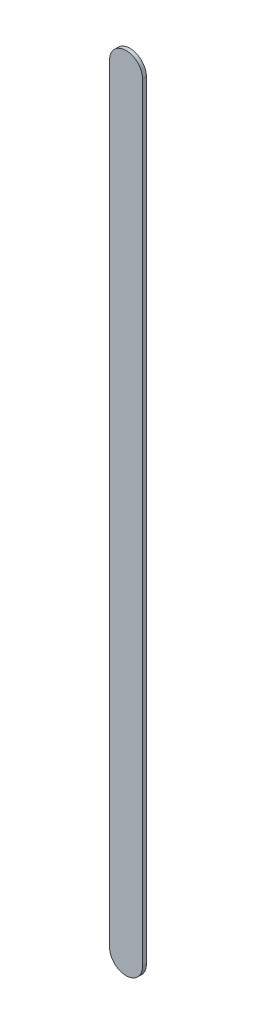
ISO-10303-21;
HEADER;
FILE_DESCRIPTION(('STEP AP214'),'2;1');
FILE_NAME('part.step','',(''),(''),'','','');
FILE_SCHEMA(('AUTOMOTIVE_DESIGN { 1 0 10303 214 1 1 1 1 }'));
ENDSEC;
DATA;
#1=APPLICATION_CONTEXT('core data for automotive mechanical design processes');
#2=APPLICATION_PROTOCOL_DEFINITION('international standard','automotive_design',2000,#1);
#3=PRODUCT_CONTEXT('',#1,'mechanical');
#4=PRODUCT('Part','Part','',(#3));
#5=PRODUCT_RELATED_PRODUCT_CATEGORY('part','',(#4));
#6=PRODUCT_DEFINITION_FORMATION('','',#4);
#7=PRODUCT_DEFINITION_CONTEXT('part definition',#1,'design');
#8=PRODUCT_DEFINITION('design','',#6,#7);
#9=PRODUCT_DEFINITION_SHAPE('','',#8);
#10=(LENGTH_UNIT() NAMED_UNIT(*) SI_UNIT(.MILLI.,.METRE.));
#11=(NAMED_UNIT(*) PLANE_ANGLE_UNIT() SI_UNIT($,.RADIAN.));
#12=(NAMED_UNIT(*) SI_UNIT($,.STERADIAN.) SOLID_ANGLE_UNIT());
#13=UNCERTAINTY_MEASURE_WITH_UNIT(LENGTH_MEASURE(1.E-05),#10,'distance_accuracy_value','');
#14=(GEOMETRIC_REPRESENTATION_CONTEXT(3) GLOBAL_UNCERTAINTY_ASSIGNED_CONTEXT((#13)) GLOBAL_UNIT_ASSIGNED_CONTEXT((#10,
#11,#12)) REPRESENTATION_CONTEXT('',''));
#15=CARTESIAN_POINT('',(0.,0.,0.));
#16=DIRECTION('',(0.,0.,1.));
#17=DIRECTION('',(1.,0.,0.));
#18=AXIS2_PLACEMENT_3D('',#15,#16,#17);
#19=CARTESIAN_POINT('',(127.07,-59.41,1.635));
#20=DIRECTION('',(0.,0.,1.));
#21=DIRECTION('',(1.,0.,0.));
#22=AXIS2_PLACEMENT_3D('',#19,#20,#21);
#23=PLANE('',#22);
#24=DIRECTION('',(0.,1.,0.));
#25=VECTOR('',#24,1.);
#26=CARTESIAN_POINT('',(127.07,-59.41,1.635));
#27=LINE('',#26,#25);
#28=CARTESIAN_POINT('',(127.07,-59.41,1.635));
#29=VERTEX_POINT('',#28);
#30=CARTESIAN_POINT('',(127.07,-52.42,1.635));
#31=VERTEX_POINT('',#30);
#32=EDGE_CURVE('E74',#29,#31,#27,.T.);
#33=ORIENTED_EDGE('',*,*,#32,.T.);
#34=CARTESIAN_POINT('',(126.92,-52.42,1.635));
#35=DIRECTION('',(0.,0.,1.));
#36=DIRECTION('',(1.,0.,0.));
#37=AXIS2_PLACEMENT_3D('',#34,#35,#36);
#38=CIRCLE('',#37,0.15);
#39=CARTESIAN_POINT('',(126.77,-52.42,1.635));
#40=VERTEX_POINT('',#39);
#41=EDGE_CURVE('E72',#31,#40,#38,.T.);
#42=ORIENTED_EDGE('',*,*,#41,.T.);
#43=DIRECTION('',(0.,-1.,0.));
#44=VECTOR('',#43,1.);
#45=CARTESIAN_POINT('',(126.77,-52.42,1.635));
#46=LINE('',#45,#44);
#47=CARTESIAN_POINT('',(126.77,-59.41,1.635));
#48=VERTEX_POINT('',#47);
#49=EDGE_CURVE('E60',#40,#48,#46,.T.);
#50=ORIENTED_EDGE('',*,*,#49,.T.);
#51=CARTESIAN_POINT('',(126.92,-59.41,1.635));
#52=DIRECTION('',(0.,0.,1.));
#53=DIRECTION('',(-1.,0.,0.));
#54=AXIS2_PLACEMENT_3D('',#51,#52,#53);
#55=CIRCLE('',#54,0.15);
#56=EDGE_CURVE('E11',#48,#29,#55,.T.);
#57=ORIENTED_EDGE('',*,*,#56,.T.);
#58=EDGE_LOOP('',(#33,#42,#50,#57));
#59=FACE_BOUND('',#58,.T.);
#60=ADVANCED_FACE('F17',(#59),#23,.T.);
#61=CARTESIAN_POINT('',(127.07,-59.41,1.6));
#62=DIRECTION('',(0.,0.,1.));
#63=DIRECTION('',(1.,0.,0.));
#64=AXIS2_PLACEMENT_3D('',#61,#62,#63);
#65=PLANE('',#64);
#66=CARTESIAN_POINT('',(126.92,-59.41,1.6));
#67=DIRECTION('',(0.,0.,1.));
#68=DIRECTION('',(-1.,0.,0.));
#69=AXIS2_PLACEMENT_3D('',#66,#67,#68);
#70=CIRCLE('',#69,0.15);
#71=CARTESIAN_POINT('',(126.77,-59.41,1.6));
#72=VERTEX_POINT('',#71);
#73=CARTESIAN_POINT('',(127.07,-59.41,1.6));
#74=VERTEX_POINT('',#73);
#75=EDGE_CURVE('E20',#72,#74,#70,.T.);
#76=ORIENTED_EDGE('',*,*,#75,.F.);
#77=DIRECTION('',(0.,-1.,0.));
#78=VECTOR('',#77,1.);
#79=CARTESIAN_POINT('',(126.77,-52.42,1.6));
#80=LINE('',#79,#78);
#81=CARTESIAN_POINT('',(126.77,-52.42,1.6));
#82=VERTEX_POINT('',#81);
#83=EDGE_CURVE('E79',#82,#72,#80,.T.);
#84=ORIENTED_EDGE('',*,*,#83,.F.);
#85=CARTESIAN_POINT('',(126.92,-52.42,1.6));
#86=DIRECTION('',(0.,0.,1.));
#87=DIRECTION('',(1.,0.,0.));
#88=AXIS2_PLACEMENT_3D('',#85,#86,#87);
#89=CIRCLE('',#88,0.15);
#90=CARTESIAN_POINT('',(127.07,-52.42,1.6));
#91=VERTEX_POINT('',#90);
#92=EDGE_CURVE('E83',#91,#82,#89,.T.);
#93=ORIENTED_EDGE('',*,*,#92,.F.);
#94=DIRECTION('',(0.,1.,0.));
#95=VECTOR('',#94,1.);
#96=CARTESIAN_POINT('',(127.07,-59.41,1.6));
#97=LINE('',#96,#95);
#98=EDGE_CURVE('E103',#74,#91,#97,.T.);
#99=ORIENTED_EDGE('',*,*,#98,.F.);
#100=EDGE_LOOP('',(#76,#84,#93,#99));
#101=FACE_BOUND('',#100,.T.);
#102=ADVANCED_FACE('F133',(#101),#65,.F.);
#103=CARTESIAN_POINT('',(126.92,-59.41,1.6));
#104=DIRECTION('',(0.,0.,-1.));
#105=DIRECTION('',(-1.,0.,0.));
#106=AXIS2_PLACEMENT_3D('',#103,#104,#105);
#107=CYLINDRICAL_SURFACE('',#106,0.15);
#108=ORIENTED_EDGE('',*,*,#75,.T.);
#109=DIRECTION('',(0.,0.,1.));
#110=VECTOR('',#109,1.);
#111=CARTESIAN_POINT('',(127.07,-59.41,1.6));
#112=LINE('',#111,#110);
#113=EDGE_CURVE('E90',#74,#29,#112,.T.);
#114=ORIENTED_EDGE('',*,*,#113,.T.);
#115=ORIENTED_EDGE('',*,*,#56,.F.);
#116=DIRECTION('',(0.,0.,1.));
#117=VECTOR('',#116,1.);
#118=CARTESIAN_POINT('',(126.77,-59.41,1.6));
#119=LINE('',#118,#117);
#120=EDGE_CURVE('E67',#72,#48,#119,.T.);
#121=ORIENTED_EDGE('',*,*,#120,.F.);
#122=EDGE_LOOP('',(#108,#114,#115,#121));
#123=FACE_BOUND('',#122,.T.);
#124=ADVANCED_FACE('F137',(#123),#107,.T.);
#125=CARTESIAN_POINT('',(126.77,-52.42,1.6));
#126=DIRECTION('',(1.,0.,0.));
#127=DIRECTION('',(0.,1.,0.));
#128=AXIS2_PLACEMENT_3D('',#125,#126,#127);
#129=PLANE('',#128);
#130=ORIENTED_EDGE('',*,*,#83,.T.);
#131=ORIENTED_EDGE('',*,*,#120,.T.);
#132=ORIENTED_EDGE('',*,*,#49,.F.);
#133=DIRECTION('',(0.,0.,1.));
#134=VECTOR('',#133,1.);
#135=CARTESIAN_POINT('',(126.77,-52.42,1.6));
#136=LINE('',#135,#134);
#137=EDGE_CURVE('E65',#82,#40,#136,.T.);
#138=ORIENTED_EDGE('',*,*,#137,.F.);
#139=EDGE_LOOP('',(#130,#131,#132,#138));
#140=FACE_BOUND('',#139,.T.);
#141=ADVANCED_FACE('F63',(#140),#129,.F.);
#142=CARTESIAN_POINT('',(126.92,-52.42,1.6));
#143=DIRECTION('',(0.,0.,-1.));
#144=DIRECTION('',(1.,0.,0.));
#145=AXIS2_PLACEMENT_3D('',#142,#143,#144);
#146=CYLINDRICAL_SURFACE('',#145,0.15);
#147=ORIENTED_EDGE('',*,*,#92,.T.);
#148=ORIENTED_EDGE('',*,*,#137,.T.);
#149=ORIENTED_EDGE('',*,*,#41,.F.);
#150=DIRECTION('',(0.,0.,1.));
#151=VECTOR('',#150,1.);
#152=CARTESIAN_POINT('',(127.07,-52.42,1.6));
#153=LINE('',#152,#151);
#154=EDGE_CURVE('E105',#91,#31,#153,.T.);
#155=ORIENTED_EDGE('',*,*,#154,.F.);
#156=EDGE_LOOP('',(#147,#148,#149,#155));
#157=FACE_BOUND('',#156,.T.);
#158=ADVANCED_FACE('F81',(#157),#146,.T.);
#159=CARTESIAN_POINT('',(127.07,-59.41,1.6));
#160=DIRECTION('',(-1.,0.,0.));
#161=DIRECTION('',(0.,0.,1.));
#162=AXIS2_PLACEMENT_3D('',#159,#160,#161);
#163=PLANE('',#162);
#164=ORIENTED_EDGE('',*,*,#98,.T.);
#165=ORIENTED_EDGE('',*,*,#154,.T.);
#166=ORIENTED_EDGE('',*,*,#32,.F.);
#167=ORIENTED_EDGE('',*,*,#113,.F.);
#168=EDGE_LOOP('',(#164,#165,#166,#167));
#169=FACE_BOUND('',#168,.T.);
#170=ADVANCED_FACE('F130',(#169),#163,.F.);
#171=CLOSED_SHELL('',(#60,#102,#124,#141,#158,#170));
#172=MANIFOLD_SOLID_BREP('B1',#171);
#173=ADVANCED_BREP_SHAPE_REPRESENTATION('',(#18,#172),#14);
#174=SHAPE_DEFINITION_REPRESENTATION(#9,#173);
ENDSEC;
END-ISO-10303-21;
